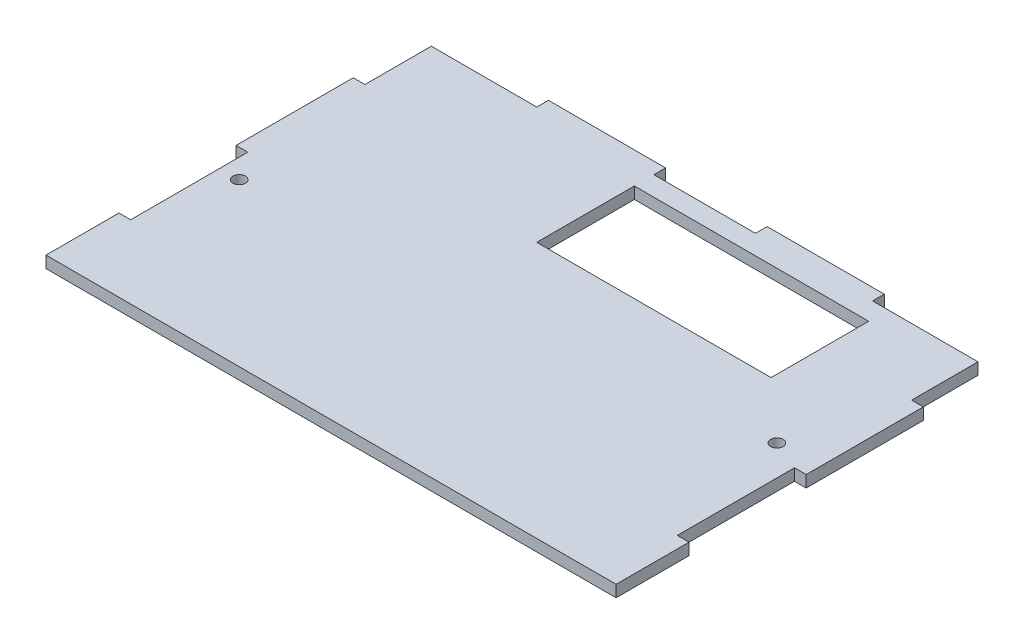
ISO-10303-21;
HEADER;
FILE_DESCRIPTION(('STEP AP214'),'2;1');
FILE_NAME('part.step','',(''),(''),'','','');
FILE_SCHEMA(('AUTOMOTIVE_DESIGN { 1 0 10303 214 1 1 1 1 }'));
ENDSEC;
DATA;
#1=APPLICATION_CONTEXT('core data for automotive mechanical design processes');
#2=APPLICATION_PROTOCOL_DEFINITION('international standard','automotive_design',2000,#1);
#3=PRODUCT_CONTEXT('',#1,'mechanical');
#4=PRODUCT('Part','Part','',(#3));
#5=PRODUCT_RELATED_PRODUCT_CATEGORY('part','',(#4));
#6=PRODUCT_DEFINITION_FORMATION('','',#4);
#7=PRODUCT_DEFINITION_CONTEXT('part definition',#1,'design');
#8=PRODUCT_DEFINITION('design','',#6,#7);
#9=PRODUCT_DEFINITION_SHAPE('','',#8);
#10=(LENGTH_UNIT() NAMED_UNIT(*) SI_UNIT(.MILLI.,.METRE.));
#11=(NAMED_UNIT(*) PLANE_ANGLE_UNIT() SI_UNIT($,.RADIAN.));
#12=(NAMED_UNIT(*) SI_UNIT($,.STERADIAN.) SOLID_ANGLE_UNIT());
#13=UNCERTAINTY_MEASURE_WITH_UNIT(LENGTH_MEASURE(1.E-05),#10,'distance_accuracy_value','');
#14=(GEOMETRIC_REPRESENTATION_CONTEXT(3) GLOBAL_UNCERTAINTY_ASSIGNED_CONTEXT((#13)) GLOBAL_UNIT_ASSIGNED_CONTEXT((#10,
#11,#12)) REPRESENTATION_CONTEXT('',''));
#15=CARTESIAN_POINT('',(0.,0.,0.));
#16=DIRECTION('',(0.,0.,1.));
#17=DIRECTION('',(1.,0.,0.));
#18=AXIS2_PLACEMENT_3D('',#15,#16,#17);
#19=CARTESIAN_POINT('',(-73.,3.,80.5));
#20=DIRECTION('',(1.,0.,0.));
#21=DIRECTION('',(0.,0.,-1.));
#22=AXIS2_PLACEMENT_3D('',#19,#20,#21);
#23=PLANE('',#22);
#24=DIRECTION('',(0.,0.,1.));
#25=VECTOR('',#24,1.);
#26=CARTESIAN_POINT('',(-73.,3.,80.5));
#27=LINE('',#26,#25);
#28=CARTESIAN_POINT('',(-73.,3.,-60.5));
#29=VERTEX_POINT('',#28);
#30=CARTESIAN_POINT('',(-73.,3.,-30.5));
#31=VERTEX_POINT('',#30);
#32=EDGE_CURVE('E281',#29,#31,#27,.T.);
#33=ORIENTED_EDGE('',*,*,#32,.F.);
#34=DIRECTION('',(0.,1.,0.));
#35=VECTOR('',#34,1.);
#36=CARTESIAN_POINT('',(-73.,0.,-60.5));
#37=LINE('',#36,#35);
#38=CARTESIAN_POINT('',(-73.,0.,-60.5));
#39=VERTEX_POINT('',#38);
#40=EDGE_CURVE('E478',#39,#29,#37,.T.);
#41=ORIENTED_EDGE('',*,*,#40,.F.);
#42=DIRECTION('',(0.,0.,1.));
#43=VECTOR('',#42,1.);
#44=CARTESIAN_POINT('',(-73.,0.,80.5));
#45=LINE('',#44,#43);
#46=CARTESIAN_POINT('',(-73.,0.,-30.5));
#47=VERTEX_POINT('',#46);
#48=EDGE_CURVE('E269',#39,#47,#45,.T.);
#49=ORIENTED_EDGE('',*,*,#48,.T.);
#50=DIRECTION('',(0.,1.,0.));
#51=VECTOR('',#50,1.);
#52=CARTESIAN_POINT('',(-73.,0.,-30.5));
#53=LINE('',#52,#51);
#54=EDGE_CURVE('E380',#47,#31,#53,.T.);
#55=ORIENTED_EDGE('',*,*,#54,.T.);
#56=EDGE_LOOP('',(#33,#41,#49,#55));
#57=FACE_BOUND('',#56,.T.);
#58=ADVANCED_FACE('F51',(#57),#23,.F.);
#59=CARTESIAN_POINT('',(-73.,0.,-0.500000000000014));
#60=VERTEX_POINT('',#59);
#61=CARTESIAN_POINT('',(-73.,0.,18.18));
#62=VERTEX_POINT('',#61);
#63=EDGE_CURVE('E271',#60,#62,#45,.T.);
#64=ORIENTED_EDGE('',*,*,#63,.T.);
#65=DIRECTION('',(0.,-1.,0.));
#66=VECTOR('',#65,1.);
#67=CARTESIAN_POINT('',(-73.,10.,18.18));
#68=LINE('',#67,#66);
#69=CARTESIAN_POINT('',(-73.,3.,18.18));
#70=VERTEX_POINT('',#69);
#71=EDGE_CURVE('E68',#70,#62,#68,.T.);
#72=ORIENTED_EDGE('',*,*,#71,.F.);
#73=CARTESIAN_POINT('',(-73.,3.,-0.500000000000014));
#74=VERTEX_POINT('',#73);
#75=EDGE_CURVE('E282',#74,#70,#27,.T.);
#76=ORIENTED_EDGE('',*,*,#75,.F.);
#77=DIRECTION('',(0.,1.,0.));
#78=VECTOR('',#77,1.);
#79=CARTESIAN_POINT('',(-73.,0.,-0.500000000000014));
#80=LINE('',#79,#78);
#81=EDGE_CURVE('E397',#60,#74,#80,.T.);
#82=ORIENTED_EDGE('',*,*,#81,.F.);
#83=EDGE_LOOP('',(#64,#72,#76,#82));
#84=FACE_BOUND('',#83,.T.);
#85=ADVANCED_FACE('F569',(#84),#23,.F.);
#86=CARTESIAN_POINT('',(73.,3.,80.5));
#87=DIRECTION('',(-1.,0.,0.));
#88=DIRECTION('',(0.,0.,1.));
#89=AXIS2_PLACEMENT_3D('',#86,#87,#88);
#90=PLANE('',#89);
#91=DIRECTION('',(0.,0.,-1.));
#92=VECTOR('',#91,1.);
#93=CARTESIAN_POINT('',(73.,3.,80.5));
#94=LINE('',#93,#92);
#95=CARTESIAN_POINT('',(73.,3.,18.18));
#96=VERTEX_POINT('',#95);
#97=CARTESIAN_POINT('',(73.,3.,-0.500000000000014));
#98=VERTEX_POINT('',#97);
#99=EDGE_CURVE('E253',#96,#98,#94,.T.);
#100=ORIENTED_EDGE('',*,*,#99,.F.);
#101=DIRECTION('',(0.,-1.,0.));
#102=VECTOR('',#101,1.);
#103=CARTESIAN_POINT('',(73.,10.,18.18));
#104=LINE('',#103,#102);
#105=CARTESIAN_POINT('',(73.,0.,18.18));
#106=VERTEX_POINT('',#105);
#107=EDGE_CURVE('E238',#96,#106,#104,.T.);
#108=ORIENTED_EDGE('',*,*,#107,.T.);
#109=DIRECTION('',(0.,0.,-1.));
#110=VECTOR('',#109,1.);
#111=CARTESIAN_POINT('',(73.,0.,80.5));
#112=LINE('',#111,#110);
#113=CARTESIAN_POINT('',(73.,0.,-0.500000000000014));
#114=VERTEX_POINT('',#113);
#115=EDGE_CURVE('E251',#106,#114,#112,.T.);
#116=ORIENTED_EDGE('',*,*,#115,.T.);
#117=DIRECTION('',(0.,1.,0.));
#118=VECTOR('',#117,1.);
#119=CARTESIAN_POINT('',(73.,0.,-0.500000000000014));
#120=LINE('',#119,#118);
#121=EDGE_CURVE('E343',#114,#98,#120,.T.);
#122=ORIENTED_EDGE('',*,*,#121,.T.);
#123=EDGE_LOOP('',(#100,#108,#116,#122));
#124=FACE_BOUND('',#123,.T.);
#125=ADVANCED_FACE('F249',(#124),#90,.F.);
#126=CARTESIAN_POINT('',(73.,3.,-80.5));
#127=DIRECTION('',(0.,0.,1.));
#128=DIRECTION('',(1.,0.,0.));
#129=AXIS2_PLACEMENT_3D('',#126,#127,#128);
#130=PLANE('',#129);
#131=DIRECTION('',(-1.,0.,0.));
#132=VECTOR('',#131,1.);
#133=CARTESIAN_POINT('',(73.,0.,-80.5));
#134=LINE('',#133,#132);
#135=CARTESIAN_POINT('',(-13.,0.,-80.5));
#136=VERTEX_POINT('',#135);
#137=CARTESIAN_POINT('',(-43.,0.,-80.5));
#138=VERTEX_POINT('',#137);
#139=EDGE_CURVE('E54',#136,#138,#134,.T.);
#140=ORIENTED_EDGE('',*,*,#139,.T.);
#141=DIRECTION('',(0.,1.,0.));
#142=VECTOR('',#141,1.);
#143=CARTESIAN_POINT('',(-43.,0.,-80.5));
#144=LINE('',#143,#142);
#145=CARTESIAN_POINT('',(-43.,3.,-80.5));
#146=VERTEX_POINT('',#145);
#147=EDGE_CURVE('E456',#138,#146,#144,.T.);
#148=ORIENTED_EDGE('',*,*,#147,.T.);
#149=DIRECTION('',(-1.,0.,0.));
#150=VECTOR('',#149,1.);
#151=CARTESIAN_POINT('',(73.,3.,-80.5));
#152=LINE('',#151,#150);
#153=CARTESIAN_POINT('',(-13.,3.,-80.5));
#154=VERTEX_POINT('',#153);
#155=EDGE_CURVE('E60',#154,#146,#152,.T.);
#156=ORIENTED_EDGE('',*,*,#155,.F.);
#157=DIRECTION('',(0.,1.,0.));
#158=VECTOR('',#157,1.);
#159=CARTESIAN_POINT('',(-13.,0.,-80.5));
#160=LINE('',#159,#158);
#161=EDGE_CURVE('E384',#136,#154,#160,.T.);
#162=ORIENTED_EDGE('',*,*,#161,.F.);
#163=EDGE_LOOP('',(#140,#148,#156,#162));
#164=FACE_BOUND('',#163,.T.);
#165=ADVANCED_FACE('F659',(#164),#130,.F.);
#166=CARTESIAN_POINT('',(73.,3.,-30.5));
#167=VERTEX_POINT('',#166);
#168=CARTESIAN_POINT('',(73.,3.,-60.5));
#169=VERTEX_POINT('',#168);
#170=EDGE_CURVE('E277',#167,#169,#94,.T.);
#171=ORIENTED_EDGE('',*,*,#170,.F.);
#172=DIRECTION('',(0.,1.,0.));
#173=VECTOR('',#172,1.);
#174=CARTESIAN_POINT('',(73.,0.,-30.5));
#175=LINE('',#174,#173);
#176=CARTESIAN_POINT('',(73.,0.,-30.5));
#177=VERTEX_POINT('',#176);
#178=EDGE_CURVE('E362',#177,#167,#175,.T.);
#179=ORIENTED_EDGE('',*,*,#178,.F.);
#180=CARTESIAN_POINT('',(73.,0.,-60.5));
#181=VERTEX_POINT('',#180);
#182=EDGE_CURVE('E263',#177,#181,#112,.T.);
#183=ORIENTED_EDGE('',*,*,#182,.T.);
#184=DIRECTION('',(0.,1.,0.));
#185=VECTOR('',#184,1.);
#186=CARTESIAN_POINT('',(73.,0.,-60.5));
#187=LINE('',#186,#185);
#188=EDGE_CURVE('E293',#181,#169,#187,.T.);
#189=ORIENTED_EDGE('',*,*,#188,.T.);
#190=EDGE_LOOP('',(#171,#179,#183,#189));
#191=FACE_BOUND('',#190,.T.);
#192=ADVANCED_FACE('F620',(#191),#90,.F.);
#193=CARTESIAN_POINT('',(43.,0.,-80.5));
#194=VERTEX_POINT('',#193);
#195=CARTESIAN_POINT('',(13.,0.,-80.5));
#196=VERTEX_POINT('',#195);
#197=EDGE_CURVE('E267',#194,#196,#134,.T.);
#198=ORIENTED_EDGE('',*,*,#197,.T.);
#199=DIRECTION('',(0.,1.,0.));
#200=VECTOR('',#199,1.);
#201=CARTESIAN_POINT('',(13.,0.,-80.5));
#202=LINE('',#201,#200);
#203=CARTESIAN_POINT('',(13.,3.,-80.5));
#204=VERTEX_POINT('',#203);
#205=EDGE_CURVE('E430',#196,#204,#202,.T.);
#206=ORIENTED_EDGE('',*,*,#205,.T.);
#207=CARTESIAN_POINT('',(43.,3.,-80.5));
#208=VERTEX_POINT('',#207);
#209=EDGE_CURVE('E11',#208,#204,#152,.T.);
#210=ORIENTED_EDGE('',*,*,#209,.F.);
#211=DIRECTION('',(0.,1.,0.));
#212=VECTOR('',#211,1.);
#213=CARTESIAN_POINT('',(43.,0.,-80.5));
#214=LINE('',#213,#212);
#215=EDGE_CURVE('E297',#194,#208,#214,.T.);
#216=ORIENTED_EDGE('',*,*,#215,.F.);
#217=EDGE_LOOP('',(#198,#206,#210,#216));
#218=FACE_BOUND('',#217,.T.);
#219=ADVANCED_FACE('F591',(#218),#130,.F.);
#220=CARTESIAN_POINT('',(0.,3.,0.));
#221=DIRECTION('',(0.,1.,0.));
#222=DIRECTION('',(0.,0.,1.));
#223=AXIS2_PLACEMENT_3D('',#220,#221,#222);
#224=PLANE('',#223);
#225=CARTESIAN_POINT('',(62.25,3.,-33.75));
#226=DIRECTION('',(0.,1.,0.));
#227=DIRECTION('',(0.,0.,1.));
#228=AXIS2_PLACEMENT_3D('',#225,#226,#227);
#229=CIRCLE('',#228,1.60000000000001);
#230=CARTESIAN_POINT('',(62.25,3.,-32.15));
#231=VERTEX_POINT('',#230);
#232=EDGE_CURVE('E245',#231,#231,#229,.T.);
#233=ORIENTED_EDGE('',*,*,#232,.F.);
#234=EDGE_LOOP('',(#233));
#235=FACE_BOUND('',#234,.T.);
#236=CARTESIAN_POINT('',(-65.,3.,-23.3));
#237=DIRECTION('',(0.,1.,0.));
#238=DIRECTION('',(0.,0.,1.));
#239=AXIS2_PLACEMENT_3D('',#236,#237,#238);
#240=CIRCLE('',#239,1.6);
#241=CARTESIAN_POINT('',(-65.,3.,-21.7));
#242=VERTEX_POINT('',#241);
#243=EDGE_CURVE('E534',#242,#242,#240,.T.);
#244=ORIENTED_EDGE('',*,*,#243,.F.);
#245=EDGE_LOOP('',(#244));
#246=FACE_BOUND('',#245,.T.);
#247=DIRECTION('',(-1.,0.,0.));
#248=VECTOR('',#247,1.);
#249=CARTESIAN_POINT('',(0.,3.,18.18));
#250=LINE('',#249,#248);
#251=EDGE_CURVE('E519',#96,#70,#250,.T.);
#252=ORIENTED_EDGE('',*,*,#251,.F.);
#253=ORIENTED_EDGE('',*,*,#99,.T.);
#254=DIRECTION('',(1.,0.,0.));
#255=VECTOR('',#254,1.);
#256=CARTESIAN_POINT('',(73.,3.,-0.500000000000014));
#257=LINE('',#256,#255);
#258=CARTESIAN_POINT('',(70.,3.,-0.500000000000014));
#259=VERTEX_POINT('',#258);
#260=EDGE_CURVE('E344',#259,#98,#257,.T.);
#261=ORIENTED_EDGE('',*,*,#260,.F.);
#262=DIRECTION('',(0.,0.,1.));
#263=VECTOR('',#262,1.);
#264=CARTESIAN_POINT('',(70.,3.,-0.500000000000014));
#265=LINE('',#264,#263);
#266=CARTESIAN_POINT('',(70.,3.,-30.5));
#267=VERTEX_POINT('',#266);
#268=EDGE_CURVE('E335',#267,#259,#265,.T.);
#269=ORIENTED_EDGE('',*,*,#268,.F.);
#270=DIRECTION('',(-1.,0.,0.));
#271=VECTOR('',#270,1.);
#272=CARTESIAN_POINT('',(70.,3.,-30.5));
#273=LINE('',#272,#271);
#274=EDGE_CURVE('E349',#167,#267,#273,.T.);
#275=ORIENTED_EDGE('',*,*,#274,.F.);
#276=ORIENTED_EDGE('',*,*,#170,.T.);
#277=DIRECTION('',(1.,0.,0.));
#278=VECTOR('',#277,1.);
#279=CARTESIAN_POINT('',(73.,3.,-60.5));
#280=LINE('',#279,#278);
#281=CARTESIAN_POINT('',(70.,3.,-60.5));
#282=VERTEX_POINT('',#281);
#283=EDGE_CURVE('E307',#282,#169,#280,.T.);
#284=ORIENTED_EDGE('',*,*,#283,.F.);
#285=DIRECTION('',(0.,0.,1.));
#286=VECTOR('',#285,1.);
#287=CARTESIAN_POINT('',(70.,3.,-77.5));
#288=LINE('',#287,#286);
#289=CARTESIAN_POINT('',(70.,3.,-77.5));
#290=VERTEX_POINT('',#289);
#291=EDGE_CURVE('E310',#290,#282,#288,.T.);
#292=ORIENTED_EDGE('',*,*,#291,.F.);
#293=DIRECTION('',(1.,0.,0.));
#294=VECTOR('',#293,1.);
#295=CARTESIAN_POINT('',(43.,3.,-77.5));
#296=LINE('',#295,#294);
#297=CARTESIAN_POINT('',(43.,3.,-77.5));
#298=VERTEX_POINT('',#297);
#299=EDGE_CURVE('E314',#298,#290,#296,.T.);
#300=ORIENTED_EDGE('',*,*,#299,.F.);
#301=DIRECTION('',(0.,0.,1.));
#302=VECTOR('',#301,1.);
#303=CARTESIAN_POINT('',(43.,3.,-80.5));
#304=LINE('',#303,#302);
#305=EDGE_CURVE('E302',#208,#298,#304,.T.);
#306=ORIENTED_EDGE('',*,*,#305,.F.);
#307=ORIENTED_EDGE('',*,*,#209,.T.);
#308=DIRECTION('',(0.,0.,-1.));
#309=VECTOR('',#308,1.);
#310=CARTESIAN_POINT('',(13.,3.,-80.5));
#311=LINE('',#310,#309);
#312=CARTESIAN_POINT('',(13.,3.,-77.5));
#313=VERTEX_POINT('',#312);
#314=EDGE_CURVE('E407',#313,#204,#311,.T.);
#315=ORIENTED_EDGE('',*,*,#314,.F.);
#316=DIRECTION('',(1.,0.,0.));
#317=VECTOR('',#316,1.);
#318=CARTESIAN_POINT('',(-13.,3.,-77.5));
#319=LINE('',#318,#317);
#320=CARTESIAN_POINT('',(-13.,3.,-77.5));
#321=VERTEX_POINT('',#320);
#322=EDGE_CURVE('E422',#321,#313,#319,.T.);
#323=ORIENTED_EDGE('',*,*,#322,.F.);
#324=DIRECTION('',(0.,0.,1.));
#325=VECTOR('',#324,1.);
#326=CARTESIAN_POINT('',(-13.,3.,-80.5));
#327=LINE('',#326,#325);
#328=EDGE_CURVE('E417',#154,#321,#327,.T.);
#329=ORIENTED_EDGE('',*,*,#328,.F.);
#330=ORIENTED_EDGE('',*,*,#155,.T.);
#331=DIRECTION('',(0.,0.,-1.));
#332=VECTOR('',#331,1.);
#333=CARTESIAN_POINT('',(-43.,3.,-80.5));
#334=LINE('',#333,#332);
#335=CARTESIAN_POINT('',(-43.,3.,-77.5));
#336=VERTEX_POINT('',#335);
#337=EDGE_CURVE('E318',#336,#146,#334,.T.);
#338=ORIENTED_EDGE('',*,*,#337,.F.);
#339=DIRECTION('',(1.,0.,0.));
#340=VECTOR('',#339,1.);
#341=CARTESIAN_POINT('',(-43.,3.,-77.5));
#342=LINE('',#341,#340);
#343=CARTESIAN_POINT('',(-70.,3.,-77.5));
#344=VERTEX_POINT('',#343);
#345=EDGE_CURVE('E443',#344,#336,#342,.T.);
#346=ORIENTED_EDGE('',*,*,#345,.F.);
#347=DIRECTION('',(0.,0.,-1.));
#348=VECTOR('',#347,1.);
#349=CARTESIAN_POINT('',(-70.,3.,-77.5));
#350=LINE('',#349,#348);
#351=CARTESIAN_POINT('',(-70.,3.,-60.5));
#352=VERTEX_POINT('',#351);
#353=EDGE_CURVE('E463',#352,#344,#350,.T.);
#354=ORIENTED_EDGE('',*,*,#353,.F.);
#355=DIRECTION('',(1.,0.,0.));
#356=VECTOR('',#355,1.);
#357=CARTESIAN_POINT('',(-73.,3.,-60.5));
#358=LINE('',#357,#356);
#359=EDGE_CURVE('E459',#29,#352,#358,.T.);
#360=ORIENTED_EDGE('',*,*,#359,.F.);
#361=ORIENTED_EDGE('',*,*,#32,.T.);
#362=DIRECTION('',(-1.,0.,0.));
#363=VECTOR('',#362,1.);
#364=CARTESIAN_POINT('',(-70.,3.,-30.5));
#365=LINE('',#364,#363);
#366=CARTESIAN_POINT('',(-70.,3.,-30.5));
#367=VERTEX_POINT('',#366);
#368=EDGE_CURVE('E381',#367,#31,#365,.T.);
#369=ORIENTED_EDGE('',*,*,#368,.F.);
#370=DIRECTION('',(0.,0.,-1.));
#371=VECTOR('',#370,1.);
#372=CARTESIAN_POINT('',(-70.,3.,-30.5));
#373=LINE('',#372,#371);
#374=CARTESIAN_POINT('',(-70.,3.,-0.500000000000014));
#375=VERTEX_POINT('',#374);
#376=EDGE_CURVE('E371',#375,#367,#373,.T.);
#377=ORIENTED_EDGE('',*,*,#376,.F.);
#378=DIRECTION('',(1.,0.,0.));
#379=VECTOR('',#378,1.);
#380=CARTESIAN_POINT('',(-73.,3.,-0.500000000000014));
#381=LINE('',#380,#379);
#382=EDGE_CURVE('E385',#74,#375,#381,.T.);
#383=ORIENTED_EDGE('',*,*,#382,.F.);
#384=ORIENTED_EDGE('',*,*,#75,.T.);
#385=EDGE_LOOP('',(#252,#253,#261,#269,#275,#276,#284,#292,#300,#306,#307,#315,#323,#329,#330,
#338,#346,#354,#360,#361,#369,#377,#383,#384));
#386=FACE_BOUND('',#385,.T.);
#387=DIRECTION('',(0.,0.,1.));
#388=VECTOR('',#387,1.);
#389=CARTESIAN_POINT('',(-13.,3.,-72.5));
#390=LINE('',#389,#388);
#391=CARTESIAN_POINT('',(-13.,3.,-72.5));
#392=VERTEX_POINT('',#391);
#393=CARTESIAN_POINT('',(-13.,3.,-47.5));
#394=VERTEX_POINT('',#393);
#395=EDGE_CURVE('E76',#392,#394,#390,.T.);
#396=ORIENTED_EDGE('',*,*,#395,.F.);
#397=DIRECTION('',(-1.,0.,0.));
#398=VECTOR('',#397,1.);
#399=CARTESIAN_POINT('',(-13.,3.,-72.5));
#400=LINE('',#399,#398);
#401=CARTESIAN_POINT('',(47.,3.,-72.5));
#402=VERTEX_POINT('',#401);
#403=EDGE_CURVE('E488',#402,#392,#400,.T.);
#404=ORIENTED_EDGE('',*,*,#403,.F.);
#405=DIRECTION('',(0.,0.,-1.));
#406=VECTOR('',#405,1.);
#407=CARTESIAN_POINT('',(47.,3.,-72.5));
#408=LINE('',#407,#406);
#409=CARTESIAN_POINT('',(47.,3.,-47.5));
#410=VERTEX_POINT('',#409);
#411=EDGE_CURVE('E508',#410,#402,#408,.T.);
#412=ORIENTED_EDGE('',*,*,#411,.F.);
#413=DIRECTION('',(1.,0.,0.));
#414=VECTOR('',#413,1.);
#415=CARTESIAN_POINT('',(-13.,3.,-47.5));
#416=LINE('',#415,#414);
#417=EDGE_CURVE('E504',#394,#410,#416,.T.);
#418=ORIENTED_EDGE('',*,*,#417,.F.);
#419=EDGE_LOOP('',(#396,#404,#412,#418));
#420=FACE_BOUND('',#419,.T.);
#421=ADVANCED_FACE('F552',(#235,#246,#386,#420),#224,.T.);
#422=CARTESIAN_POINT('',(0.,0.,0.));
#423=DIRECTION('',(0.,1.,0.));
#424=DIRECTION('',(0.,0.,1.));
#425=AXIS2_PLACEMENT_3D('',#422,#423,#424);
#426=PLANE('',#425);
#427=CARTESIAN_POINT('',(62.25,0.,-33.75));
#428=DIRECTION('',(0.,-1.,0.));
#429=DIRECTION('',(0.,0.,-1.));
#430=AXIS2_PLACEMENT_3D('',#427,#428,#429);
#431=CIRCLE('',#430,1.60000000000001);
#432=CARTESIAN_POINT('',(62.25,0.,-35.35));
#433=VERTEX_POINT('',#432);
#434=EDGE_CURVE('E538',#433,#433,#431,.T.);
#435=ORIENTED_EDGE('',*,*,#434,.F.);
#436=EDGE_LOOP('',(#435));
#437=FACE_BOUND('',#436,.T.);
#438=CARTESIAN_POINT('',(-65.,0.,-23.3));
#439=DIRECTION('',(0.,-1.,0.));
#440=DIRECTION('',(0.,0.,-1.));
#441=AXIS2_PLACEMENT_3D('',#438,#439,#440);
#442=CIRCLE('',#441,1.6);
#443=CARTESIAN_POINT('',(-65.,0.,-24.9));
#444=VERTEX_POINT('',#443);
#445=EDGE_CURVE('E539',#444,#444,#442,.T.);
#446=ORIENTED_EDGE('',*,*,#445,.F.);
#447=EDGE_LOOP('',(#446));
#448=FACE_BOUND('',#447,.T.);
#449=ORIENTED_EDGE('',*,*,#115,.F.);
#450=DIRECTION('',(1.,0.,0.));
#451=VECTOR('',#450,1.);
#452=CARTESIAN_POINT('',(-73.,0.,18.18));
#453=LINE('',#452,#451);
#454=EDGE_CURVE('E235',#62,#106,#453,.T.);
#455=ORIENTED_EDGE('',*,*,#454,.F.);
#456=ORIENTED_EDGE('',*,*,#63,.F.);
#457=DIRECTION('',(1.,0.,0.));
#458=VECTOR('',#457,1.);
#459=CARTESIAN_POINT('',(-73.,0.,-0.500000000000014));
#460=LINE('',#459,#458);
#461=CARTESIAN_POINT('',(-70.,0.,-0.500000000000014));
#462=VERTEX_POINT('',#461);
#463=EDGE_CURVE('E372',#60,#462,#460,.T.);
#464=ORIENTED_EDGE('',*,*,#463,.T.);
#465=DIRECTION('',(0.,0.,-1.));
#466=VECTOR('',#465,1.);
#467=CARTESIAN_POINT('',(-70.,0.,-30.5));
#468=LINE('',#467,#466);
#469=CARTESIAN_POINT('',(-70.,0.,-30.5));
#470=VERTEX_POINT('',#469);
#471=EDGE_CURVE('E376',#462,#470,#468,.T.);
#472=ORIENTED_EDGE('',*,*,#471,.T.);
#473=DIRECTION('',(-1.,0.,0.));
#474=VECTOR('',#473,1.);
#475=CARTESIAN_POINT('',(-70.,0.,-30.5));
#476=LINE('',#475,#474);
#477=EDGE_CURVE('E367',#470,#47,#476,.T.);
#478=ORIENTED_EDGE('',*,*,#477,.T.);
#479=ORIENTED_EDGE('',*,*,#48,.F.);
#480=DIRECTION('',(1.,0.,0.));
#481=VECTOR('',#480,1.);
#482=CARTESIAN_POINT('',(-73.,0.,-60.5));
#483=LINE('',#482,#481);
#484=CARTESIAN_POINT('',(-70.,0.,-60.5));
#485=VERTEX_POINT('',#484);
#486=EDGE_CURVE('E444',#39,#485,#483,.T.);
#487=ORIENTED_EDGE('',*,*,#486,.T.);
#488=DIRECTION('',(0.,0.,-1.));
#489=VECTOR('',#488,1.);
#490=CARTESIAN_POINT('',(-70.,0.,-77.5));
#491=LINE('',#490,#489);
#492=CARTESIAN_POINT('',(-70.,0.,-77.5));
#493=VERTEX_POINT('',#492);
#494=EDGE_CURVE('E448',#485,#493,#491,.T.);
#495=ORIENTED_EDGE('',*,*,#494,.T.);
#496=DIRECTION('',(1.,0.,0.));
#497=VECTOR('',#496,1.);
#498=CARTESIAN_POINT('',(-43.,0.,-77.5));
#499=LINE('',#498,#497);
#500=CARTESIAN_POINT('',(-43.,0.,-77.5));
#501=VERTEX_POINT('',#500);
#502=EDGE_CURVE('E452',#493,#501,#499,.T.);
#503=ORIENTED_EDGE('',*,*,#502,.T.);
#504=DIRECTION('',(0.,0.,-1.));
#505=VECTOR('',#504,1.);
#506=CARTESIAN_POINT('',(-43.,0.,-80.5));
#507=LINE('',#506,#505);
#508=EDGE_CURVE('E439',#501,#138,#507,.T.);
#509=ORIENTED_EDGE('',*,*,#508,.T.);
#510=ORIENTED_EDGE('',*,*,#139,.F.);
#511=DIRECTION('',(0.,0.,1.));
#512=VECTOR('',#511,1.);
#513=CARTESIAN_POINT('',(-13.,0.,-80.5));
#514=LINE('',#513,#512);
#515=CARTESIAN_POINT('',(-13.,0.,-77.5));
#516=VERTEX_POINT('',#515);
#517=EDGE_CURVE('E403',#136,#516,#514,.T.);
#518=ORIENTED_EDGE('',*,*,#517,.T.);
#519=DIRECTION('',(1.,0.,0.));
#520=VECTOR('',#519,1.);
#521=CARTESIAN_POINT('',(-13.,0.,-77.5));
#522=LINE('',#521,#520);
#523=CARTESIAN_POINT('',(13.,0.,-77.5));
#524=VERTEX_POINT('',#523);
#525=EDGE_CURVE('E408',#516,#524,#522,.T.);
#526=ORIENTED_EDGE('',*,*,#525,.T.);
#527=DIRECTION('',(0.,0.,-1.));
#528=VECTOR('',#527,1.);
#529=CARTESIAN_POINT('',(13.,0.,-80.5));
#530=LINE('',#529,#528);
#531=EDGE_CURVE('E412',#524,#196,#530,.T.);
#532=ORIENTED_EDGE('',*,*,#531,.T.);
#533=ORIENTED_EDGE('',*,*,#197,.F.);
#534=DIRECTION('',(0.,0.,1.));
#535=VECTOR('',#534,1.);
#536=CARTESIAN_POINT('',(43.,0.,-80.5));
#537=LINE('',#536,#535);
#538=CARTESIAN_POINT('',(43.,0.,-77.5));
#539=VERTEX_POINT('',#538);
#540=EDGE_CURVE('E290',#194,#539,#537,.T.);
#541=ORIENTED_EDGE('',*,*,#540,.T.);
#542=DIRECTION('',(1.,0.,0.));
#543=VECTOR('',#542,1.);
#544=CARTESIAN_POINT('',(43.,0.,-77.5));
#545=LINE('',#544,#543);
#546=CARTESIAN_POINT('',(70.,0.,-77.5));
#547=VERTEX_POINT('',#546);
#548=EDGE_CURVE('E306',#539,#547,#545,.T.);
#549=ORIENTED_EDGE('',*,*,#548,.T.);
#550=DIRECTION('',(0.,0.,1.));
#551=VECTOR('',#550,1.);
#552=CARTESIAN_POINT('',(70.,0.,-77.5));
#553=LINE('',#552,#551);
#554=CARTESIAN_POINT('',(70.,0.,-60.5));
#555=VERTEX_POINT('',#554);
#556=EDGE_CURVE('E326',#547,#555,#553,.T.);
#557=ORIENTED_EDGE('',*,*,#556,.T.);
#558=DIRECTION('',(1.,0.,0.));
#559=VECTOR('',#558,1.);
#560=CARTESIAN_POINT('',(73.,0.,-60.5));
#561=LINE('',#560,#559);
#562=EDGE_CURVE('E322',#555,#181,#561,.T.);
#563=ORIENTED_EDGE('',*,*,#562,.T.);
#564=ORIENTED_EDGE('',*,*,#182,.F.);
#565=DIRECTION('',(-1.,0.,0.));
#566=VECTOR('',#565,1.);
#567=CARTESIAN_POINT('',(70.,0.,-30.5));
#568=LINE('',#567,#566);
#569=CARTESIAN_POINT('',(70.,0.,-30.5));
#570=VERTEX_POINT('',#569);
#571=EDGE_CURVE('E336',#177,#570,#568,.T.);
#572=ORIENTED_EDGE('',*,*,#571,.T.);
#573=DIRECTION('',(0.,0.,1.));
#574=VECTOR('',#573,1.);
#575=CARTESIAN_POINT('',(70.,0.,-0.500000000000014));
#576=LINE('',#575,#574);
#577=CARTESIAN_POINT('',(70.,0.,-0.500000000000014));
#578=VERTEX_POINT('',#577);
#579=EDGE_CURVE('E340',#570,#578,#576,.T.);
#580=ORIENTED_EDGE('',*,*,#579,.T.);
#581=DIRECTION('',(1.,0.,0.));
#582=VECTOR('',#581,1.);
#583=CARTESIAN_POINT('',(73.,0.,-0.500000000000014));
#584=LINE('',#583,#582);
#585=EDGE_CURVE('E261',#578,#114,#584,.T.);
#586=ORIENTED_EDGE('',*,*,#585,.T.);
#587=EDGE_LOOP('',(#449,#455,#456,#464,#472,#478,#479,#487,#495,#503,#509,#510,#518,#526,#532,
#533,#541,#549,#557,#563,#564,#572,#580,#586));
#588=FACE_BOUND('',#587,.T.);
#589=DIRECTION('',(-1.,0.,0.));
#590=VECTOR('',#589,1.);
#591=CARTESIAN_POINT('',(-13.,0.,-72.5));
#592=LINE('',#591,#590);
#593=CARTESIAN_POINT('',(47.,0.,-72.5));
#594=VERTEX_POINT('',#593);
#595=CARTESIAN_POINT('',(-13.,0.,-72.5));
#596=VERTEX_POINT('',#595);
#597=EDGE_CURVE('E497',#594,#596,#592,.T.);
#598=ORIENTED_EDGE('',*,*,#597,.T.);
#599=DIRECTION('',(0.,0.,1.));
#600=VECTOR('',#599,1.);
#601=CARTESIAN_POINT('',(-13.,0.,-72.5));
#602=LINE('',#601,#600);
#603=CARTESIAN_POINT('',(-13.,0.,-47.5));
#604=VERTEX_POINT('',#603);
#605=EDGE_CURVE('E484',#596,#604,#602,.T.);
#606=ORIENTED_EDGE('',*,*,#605,.T.);
#607=DIRECTION('',(1.,0.,0.));
#608=VECTOR('',#607,1.);
#609=CARTESIAN_POINT('',(-13.,0.,-47.5));
#610=LINE('',#609,#608);
#611=CARTESIAN_POINT('',(47.,0.,-47.5));
#612=VERTEX_POINT('',#611);
#613=EDGE_CURVE('E489',#604,#612,#610,.T.);
#614=ORIENTED_EDGE('',*,*,#613,.T.);
#615=DIRECTION('',(0.,0.,-1.));
#616=VECTOR('',#615,1.);
#617=CARTESIAN_POINT('',(47.,0.,-72.5));
#618=LINE('',#617,#616);
#619=EDGE_CURVE('E493',#612,#594,#618,.T.);
#620=ORIENTED_EDGE('',*,*,#619,.T.);
#621=EDGE_LOOP('',(#598,#606,#614,#620));
#622=FACE_BOUND('',#621,.T.);
#623=ADVANCED_FACE('F257',(#437,#448,#588,#622),#426,.F.);
#624=CARTESIAN_POINT('',(43.,0.,-77.5));
#625=DIRECTION('',(0.,0.,1.));
#626=DIRECTION('',(1.,0.,0.));
#627=AXIS2_PLACEMENT_3D('',#624,#625,#626);
#628=PLANE('',#627);
#629=ORIENTED_EDGE('',*,*,#299,.T.);
#630=DIRECTION('',(0.,1.,0.));
#631=VECTOR('',#630,1.);
#632=CARTESIAN_POINT('',(70.,0.,-77.5));
#633=LINE('',#632,#631);
#634=EDGE_CURVE('E286',#547,#290,#633,.T.);
#635=ORIENTED_EDGE('',*,*,#634,.F.);
#636=ORIENTED_EDGE('',*,*,#548,.F.);
#637=DIRECTION('',(0.,1.,0.));
#638=VECTOR('',#637,1.);
#639=CARTESIAN_POINT('',(43.,0.,-77.5));
#640=LINE('',#639,#638);
#641=EDGE_CURVE('E273',#539,#298,#640,.T.);
#642=ORIENTED_EDGE('',*,*,#641,.T.);
#643=EDGE_LOOP('',(#629,#635,#636,#642));
#644=FACE_BOUND('',#643,.T.);
#645=ADVANCED_FACE('F551',(#644),#628,.F.);
#646=CARTESIAN_POINT('',(43.,0.,-80.5));
#647=DIRECTION('',(-1.,0.,0.));
#648=DIRECTION('',(0.,0.,1.));
#649=AXIS2_PLACEMENT_3D('',#646,#647,#648);
#650=PLANE('',#649);
#651=ORIENTED_EDGE('',*,*,#305,.T.);
#652=ORIENTED_EDGE('',*,*,#641,.F.);
#653=ORIENTED_EDGE('',*,*,#540,.F.);
#654=ORIENTED_EDGE('',*,*,#215,.T.);
#655=EDGE_LOOP('',(#651,#652,#653,#654));
#656=FACE_BOUND('',#655,.T.);
#657=ADVANCED_FACE('F607',(#656),#650,.F.);
#658=CARTESIAN_POINT('',(73.,0.,-60.5));
#659=DIRECTION('',(0.,0.,1.));
#660=DIRECTION('',(1.,0.,0.));
#661=AXIS2_PLACEMENT_3D('',#658,#659,#660);
#662=PLANE('',#661);
#663=ORIENTED_EDGE('',*,*,#283,.T.);
#664=ORIENTED_EDGE('',*,*,#188,.F.);
#665=ORIENTED_EDGE('',*,*,#562,.F.);
#666=DIRECTION('',(0.,1.,0.));
#667=VECTOR('',#666,1.);
#668=CARTESIAN_POINT('',(70.,0.,-60.5));
#669=LINE('',#668,#667);
#670=EDGE_CURVE('E289',#555,#282,#669,.T.);
#671=ORIENTED_EDGE('',*,*,#670,.T.);
#672=EDGE_LOOP('',(#663,#664,#665,#671));
#673=FACE_BOUND('',#672,.T.);
#674=ADVANCED_FACE('F617',(#673),#662,.F.);
#675=CARTESIAN_POINT('',(70.,0.,-77.5));
#676=DIRECTION('',(-1.,0.,0.));
#677=DIRECTION('',(0.,0.,1.));
#678=AXIS2_PLACEMENT_3D('',#675,#676,#677);
#679=PLANE('',#678);
#680=ORIENTED_EDGE('',*,*,#291,.T.);
#681=ORIENTED_EDGE('',*,*,#670,.F.);
#682=ORIENTED_EDGE('',*,*,#556,.F.);
#683=ORIENTED_EDGE('',*,*,#634,.T.);
#684=EDGE_LOOP('',(#680,#681,#682,#683));
#685=FACE_BOUND('',#684,.T.);
#686=ADVANCED_FACE('F614',(#685),#679,.F.);
#687=CARTESIAN_POINT('',(-13.,0.,-72.5));
#688=DIRECTION('',(-1.,0.,0.));
#689=DIRECTION('',(0.,0.,1.));
#690=AXIS2_PLACEMENT_3D('',#687,#688,#689);
#691=PLANE('',#690);
#692=ORIENTED_EDGE('',*,*,#395,.T.);
#693=DIRECTION('',(0.,1.,0.));
#694=VECTOR('',#693,1.);
#695=CARTESIAN_POINT('',(-13.,0.,-47.5));
#696=LINE('',#695,#694);
#697=EDGE_CURVE('E501',#604,#394,#696,.T.);
#698=ORIENTED_EDGE('',*,*,#697,.F.);
#699=ORIENTED_EDGE('',*,*,#605,.F.);
#700=DIRECTION('',(0.,1.,0.));
#701=VECTOR('',#700,1.);
#702=CARTESIAN_POINT('',(-13.,0.,-72.5));
#703=LINE('',#702,#701);
#704=EDGE_CURVE('E515',#596,#392,#703,.T.);
#705=ORIENTED_EDGE('',*,*,#704,.T.);
#706=EDGE_LOOP('',(#692,#698,#699,#705));
#707=FACE_BOUND('',#706,.T.);
#708=ADVANCED_FACE('F704',(#707),#691,.F.);
#709=CARTESIAN_POINT('',(-13.,0.,-72.5));
#710=DIRECTION('',(0.,0.,-1.));
#711=DIRECTION('',(-1.,0.,0.));
#712=AXIS2_PLACEMENT_3D('',#709,#710,#711);
#713=PLANE('',#712);
#714=ORIENTED_EDGE('',*,*,#403,.T.);
#715=ORIENTED_EDGE('',*,*,#704,.F.);
#716=ORIENTED_EDGE('',*,*,#597,.F.);
#717=DIRECTION('',(0.,1.,0.));
#718=VECTOR('',#717,1.);
#719=CARTESIAN_POINT('',(47.,0.,-72.5));
#720=LINE('',#719,#718);
#721=EDGE_CURVE('E518',#594,#402,#720,.T.);
#722=ORIENTED_EDGE('',*,*,#721,.T.);
#723=EDGE_LOOP('',(#714,#715,#716,#722));
#724=FACE_BOUND('',#723,.T.);
#725=ADVANCED_FACE('F675',(#724),#713,.F.);
#726=CARTESIAN_POINT('',(47.,0.,-72.5));
#727=DIRECTION('',(1.,0.,0.));
#728=DIRECTION('',(0.,0.,-1.));
#729=AXIS2_PLACEMENT_3D('',#726,#727,#728);
#730=PLANE('',#729);
#731=ORIENTED_EDGE('',*,*,#411,.T.);
#732=ORIENTED_EDGE('',*,*,#721,.F.);
#733=ORIENTED_EDGE('',*,*,#619,.F.);
#734=DIRECTION('',(0.,1.,0.));
#735=VECTOR('',#734,1.);
#736=CARTESIAN_POINT('',(47.,0.,-47.5));
#737=LINE('',#736,#735);
#738=EDGE_CURVE('E522',#612,#410,#737,.T.);
#739=ORIENTED_EDGE('',*,*,#738,.T.);
#740=EDGE_LOOP('',(#731,#732,#733,#739));
#741=FACE_BOUND('',#740,.T.);
#742=ADVANCED_FACE('F797',(#741),#730,.F.);
#743=CARTESIAN_POINT('',(-13.,0.,-47.5));
#744=DIRECTION('',(0.,0.,1.));
#745=DIRECTION('',(1.,0.,0.));
#746=AXIS2_PLACEMENT_3D('',#743,#744,#745);
#747=PLANE('',#746);
#748=ORIENTED_EDGE('',*,*,#417,.T.);
#749=ORIENTED_EDGE('',*,*,#738,.F.);
#750=ORIENTED_EDGE('',*,*,#613,.F.);
#751=ORIENTED_EDGE('',*,*,#697,.T.);
#752=EDGE_LOOP('',(#748,#749,#750,#751));
#753=FACE_BOUND('',#752,.T.);
#754=ADVANCED_FACE('F693',(#753),#747,.F.);
#755=CARTESIAN_POINT('',(73.,0.,-0.500000000000014));
#756=DIRECTION('',(0.,0.,1.));
#757=DIRECTION('',(1.,0.,0.));
#758=AXIS2_PLACEMENT_3D('',#755,#756,#757);
#759=PLANE('',#758);
#760=ORIENTED_EDGE('',*,*,#260,.T.);
#761=ORIENTED_EDGE('',*,*,#121,.F.);
#762=ORIENTED_EDGE('',*,*,#585,.F.);
#763=DIRECTION('',(0.,1.,0.));
#764=VECTOR('',#763,1.);
#765=CARTESIAN_POINT('',(70.,0.,-0.500000000000014));
#766=LINE('',#765,#764);
#767=EDGE_CURVE('E356',#578,#259,#766,.T.);
#768=ORIENTED_EDGE('',*,*,#767,.T.);
#769=EDGE_LOOP('',(#760,#761,#762,#768));
#770=FACE_BOUND('',#769,.T.);
#771=ADVANCED_FACE('F631',(#770),#759,.F.);
#772=CARTESIAN_POINT('',(70.,0.,-0.500000000000014));
#773=DIRECTION('',(-1.,0.,0.));
#774=DIRECTION('',(0.,0.,1.));
#775=AXIS2_PLACEMENT_3D('',#772,#773,#774);
#776=PLANE('',#775);
#777=ORIENTED_EDGE('',*,*,#268,.T.);
#778=ORIENTED_EDGE('',*,*,#767,.F.);
#779=ORIENTED_EDGE('',*,*,#579,.F.);
#780=DIRECTION('',(0.,1.,0.));
#781=VECTOR('',#780,1.);
#782=CARTESIAN_POINT('',(70.,0.,-30.5));
#783=LINE('',#782,#781);
#784=EDGE_CURVE('E359',#570,#267,#783,.T.);
#785=ORIENTED_EDGE('',*,*,#784,.T.);
#786=EDGE_LOOP('',(#777,#778,#779,#785));
#787=FACE_BOUND('',#786,.T.);
#788=ADVANCED_FACE('F629',(#787),#776,.F.);
#789=CARTESIAN_POINT('',(70.,0.,-30.5));
#790=DIRECTION('',(0.,0.,-1.));
#791=DIRECTION('',(-1.,0.,0.));
#792=AXIS2_PLACEMENT_3D('',#789,#790,#791);
#793=PLANE('',#792);
#794=ORIENTED_EDGE('',*,*,#274,.T.);
#795=ORIENTED_EDGE('',*,*,#784,.F.);
#796=ORIENTED_EDGE('',*,*,#571,.F.);
#797=ORIENTED_EDGE('',*,*,#178,.T.);
#798=EDGE_LOOP('',(#794,#795,#796,#797));
#799=FACE_BOUND('',#798,.T.);
#800=ADVANCED_FACE('F627',(#799),#793,.F.);
#801=CARTESIAN_POINT('',(-70.,0.,-30.5));
#802=DIRECTION('',(0.,0.,-1.));
#803=DIRECTION('',(-1.,0.,0.));
#804=AXIS2_PLACEMENT_3D('',#801,#802,#803);
#805=PLANE('',#804);
#806=ORIENTED_EDGE('',*,*,#368,.T.);
#807=ORIENTED_EDGE('',*,*,#54,.F.);
#808=ORIENTED_EDGE('',*,*,#477,.F.);
#809=DIRECTION('',(0.,1.,0.));
#810=VECTOR('',#809,1.);
#811=CARTESIAN_POINT('',(-70.,0.,-30.5));
#812=LINE('',#811,#810);
#813=EDGE_CURVE('E348',#470,#367,#812,.T.);
#814=ORIENTED_EDGE('',*,*,#813,.T.);
#815=EDGE_LOOP('',(#806,#807,#808,#814));
#816=FACE_BOUND('',#815,.T.);
#817=ADVANCED_FACE('F643',(#816),#805,.F.);
#818=CARTESIAN_POINT('',(-70.,0.,-30.5));
#819=DIRECTION('',(1.,0.,0.));
#820=DIRECTION('',(0.,0.,-1.));
#821=AXIS2_PLACEMENT_3D('',#818,#819,#820);
#822=PLANE('',#821);
#823=ORIENTED_EDGE('',*,*,#376,.T.);
#824=ORIENTED_EDGE('',*,*,#813,.F.);
#825=ORIENTED_EDGE('',*,*,#471,.F.);
#826=DIRECTION('',(0.,1.,0.));
#827=VECTOR('',#826,1.);
#828=CARTESIAN_POINT('',(-70.,0.,-0.500000000000014));
#829=LINE('',#828,#827);
#830=EDGE_CURVE('E394',#462,#375,#829,.T.);
#831=ORIENTED_EDGE('',*,*,#830,.T.);
#832=EDGE_LOOP('',(#823,#824,#825,#831));
#833=FACE_BOUND('',#832,.T.);
#834=ADVANCED_FACE('F640',(#833),#822,.F.);
#835=CARTESIAN_POINT('',(-73.,0.,-0.500000000000014));
#836=DIRECTION('',(0.,0.,1.));
#837=DIRECTION('',(1.,0.,0.));
#838=AXIS2_PLACEMENT_3D('',#835,#836,#837);
#839=PLANE('',#838);
#840=ORIENTED_EDGE('',*,*,#382,.T.);
#841=ORIENTED_EDGE('',*,*,#830,.F.);
#842=ORIENTED_EDGE('',*,*,#463,.F.);
#843=ORIENTED_EDGE('',*,*,#81,.T.);
#844=EDGE_LOOP('',(#840,#841,#842,#843));
#845=FACE_BOUND('',#844,.T.);
#846=ADVANCED_FACE('F637',(#845),#839,.F.);
#847=CARTESIAN_POINT('',(-13.,0.,-80.5));
#848=DIRECTION('',(-1.,0.,0.));
#849=DIRECTION('',(0.,0.,1.));
#850=AXIS2_PLACEMENT_3D('',#847,#848,#849);
#851=PLANE('',#850);
#852=ORIENTED_EDGE('',*,*,#328,.T.);
#853=DIRECTION('',(0.,1.,0.));
#854=VECTOR('',#853,1.);
#855=CARTESIAN_POINT('',(-13.,0.,-77.5));
#856=LINE('',#855,#854);
#857=EDGE_CURVE('E416',#516,#321,#856,.T.);
#858=ORIENTED_EDGE('',*,*,#857,.F.);
#859=ORIENTED_EDGE('',*,*,#517,.F.);
#860=ORIENTED_EDGE('',*,*,#161,.T.);
#861=EDGE_LOOP('',(#852,#858,#859,#860));
#862=FACE_BOUND('',#861,.T.);
#863=ADVANCED_FACE('F662',(#862),#851,.F.);
#864=CARTESIAN_POINT('',(13.,0.,-80.5));
#865=DIRECTION('',(1.,0.,0.));
#866=DIRECTION('',(0.,0.,-1.));
#867=AXIS2_PLACEMENT_3D('',#864,#865,#866);
#868=PLANE('',#867);
#869=ORIENTED_EDGE('',*,*,#314,.T.);
#870=ORIENTED_EDGE('',*,*,#205,.F.);
#871=ORIENTED_EDGE('',*,*,#531,.F.);
#872=DIRECTION('',(0.,1.,0.));
#873=VECTOR('',#872,1.);
#874=CARTESIAN_POINT('',(13.,0.,-77.5));
#875=LINE('',#874,#873);
#876=EDGE_CURVE('E434',#524,#313,#875,.T.);
#877=ORIENTED_EDGE('',*,*,#876,.T.);
#878=EDGE_LOOP('',(#869,#870,#871,#877));
#879=FACE_BOUND('',#878,.T.);
#880=ADVANCED_FACE('F596',(#879),#868,.F.);
#881=CARTESIAN_POINT('',(-13.,0.,-77.5));
#882=DIRECTION('',(0.,0.,1.));
#883=DIRECTION('',(1.,0.,0.));
#884=AXIS2_PLACEMENT_3D('',#881,#882,#883);
#885=PLANE('',#884);
#886=ORIENTED_EDGE('',*,*,#322,.T.);
#887=ORIENTED_EDGE('',*,*,#876,.F.);
#888=ORIENTED_EDGE('',*,*,#525,.F.);
#889=ORIENTED_EDGE('',*,*,#857,.T.);
#890=EDGE_LOOP('',(#886,#887,#888,#889));
#891=FACE_BOUND('',#890,.T.);
#892=ADVANCED_FACE('F598',(#891),#885,.F.);
#893=CARTESIAN_POINT('',(-43.,0.,-80.5));
#894=DIRECTION('',(1.,0.,0.));
#895=DIRECTION('',(0.,0.,-1.));
#896=AXIS2_PLACEMENT_3D('',#893,#894,#895);
#897=PLANE('',#896);
#898=ORIENTED_EDGE('',*,*,#337,.T.);
#899=ORIENTED_EDGE('',*,*,#147,.F.);
#900=ORIENTED_EDGE('',*,*,#508,.F.);
#901=DIRECTION('',(0.,1.,0.));
#902=VECTOR('',#901,1.);
#903=CARTESIAN_POINT('',(-43.,0.,-77.5));
#904=LINE('',#903,#902);
#905=EDGE_CURVE('E421',#501,#336,#904,.T.);
#906=ORIENTED_EDGE('',*,*,#905,.T.);
#907=EDGE_LOOP('',(#898,#899,#900,#906));
#908=FACE_BOUND('',#907,.T.);
#909=ADVANCED_FACE('F664',(#908),#897,.F.);
#910=CARTESIAN_POINT('',(-43.,0.,-77.5));
#911=DIRECTION('',(0.,0.,1.));
#912=DIRECTION('',(1.,0.,0.));
#913=AXIS2_PLACEMENT_3D('',#910,#911,#912);
#914=PLANE('',#913);
#915=ORIENTED_EDGE('',*,*,#345,.T.);
#916=ORIENTED_EDGE('',*,*,#905,.F.);
#917=ORIENTED_EDGE('',*,*,#502,.F.);
#918=DIRECTION('',(0.,1.,0.));
#919=VECTOR('',#918,1.);
#920=CARTESIAN_POINT('',(-70.,0.,-77.5));
#921=LINE('',#920,#919);
#922=EDGE_CURVE('E472',#493,#344,#921,.T.);
#923=ORIENTED_EDGE('',*,*,#922,.T.);
#924=EDGE_LOOP('',(#915,#916,#917,#923));
#925=FACE_BOUND('',#924,.T.);
#926=ADVANCED_FACE('F653',(#925),#914,.F.);
#927=CARTESIAN_POINT('',(-70.,0.,-77.5));
#928=DIRECTION('',(1.,0.,0.));
#929=DIRECTION('',(0.,0.,-1.));
#930=AXIS2_PLACEMENT_3D('',#927,#928,#929);
#931=PLANE('',#930);
#932=ORIENTED_EDGE('',*,*,#353,.T.);
#933=ORIENTED_EDGE('',*,*,#922,.F.);
#934=ORIENTED_EDGE('',*,*,#494,.F.);
#935=DIRECTION('',(0.,1.,0.));
#936=VECTOR('',#935,1.);
#937=CARTESIAN_POINT('',(-70.,0.,-60.5));
#938=LINE('',#937,#936);
#939=EDGE_CURVE('E475',#485,#352,#938,.T.);
#940=ORIENTED_EDGE('',*,*,#939,.T.);
#941=EDGE_LOOP('',(#932,#933,#934,#940));
#942=FACE_BOUND('',#941,.T.);
#943=ADVANCED_FACE('F649',(#942),#931,.F.);
#944=CARTESIAN_POINT('',(-73.,0.,-60.5));
#945=DIRECTION('',(0.,0.,1.));
#946=DIRECTION('',(1.,0.,0.));
#947=AXIS2_PLACEMENT_3D('',#944,#945,#946);
#948=PLANE('',#947);
#949=ORIENTED_EDGE('',*,*,#359,.T.);
#950=ORIENTED_EDGE('',*,*,#939,.F.);
#951=ORIENTED_EDGE('',*,*,#486,.F.);
#952=ORIENTED_EDGE('',*,*,#40,.T.);
#953=EDGE_LOOP('',(#949,#950,#951,#952));
#954=FACE_BOUND('',#953,.T.);
#955=ADVANCED_FACE('F566',(#954),#948,.F.);
#956=CARTESIAN_POINT('',(-73.,10.,18.18));
#957=DIRECTION('',(0.,0.,-1.));
#958=DIRECTION('',(-1.,0.,0.));
#959=AXIS2_PLACEMENT_3D('',#956,#957,#958);
#960=PLANE('',#959);
#961=ORIENTED_EDGE('',*,*,#251,.T.);
#962=ORIENTED_EDGE('',*,*,#71,.T.);
#963=ORIENTED_EDGE('',*,*,#454,.T.);
#964=ORIENTED_EDGE('',*,*,#107,.F.);
#965=EDGE_LOOP('',(#961,#962,#963,#964));
#966=FACE_BOUND('',#965,.T.);
#967=ADVANCED_FACE('F237',(#966),#960,.F.);
#968=CARTESIAN_POINT('',(-65.,10.,-23.3));
#969=DIRECTION('',(0.,-1.,0.));
#970=DIRECTION('',(0.,0.,-1.));
#971=AXIS2_PLACEMENT_3D('',#968,#969,#970);
#972=CYLINDRICAL_SURFACE('',#971,1.6);
#973=ORIENTED_EDGE('',*,*,#243,.T.);
#974=EDGE_LOOP('',(#973));
#975=FACE_BOUND('',#974,.T.);
#976=ORIENTED_EDGE('',*,*,#445,.T.);
#977=EDGE_LOOP('',(#976));
#978=FACE_BOUND('',#977,.T.);
#979=ADVANCED_FACE('F556',(#975,#978),#972,.F.);
#980=CARTESIAN_POINT('',(62.25,10.,-33.75));
#981=DIRECTION('',(0.,-1.,0.));
#982=DIRECTION('',(0.,0.,-1.));
#983=AXIS2_PLACEMENT_3D('',#980,#981,#982);
#984=CYLINDRICAL_SURFACE('',#983,1.60000000000001);
#985=ORIENTED_EDGE('',*,*,#232,.T.);
#986=EDGE_LOOP('',(#985));
#987=FACE_BOUND('',#986,.T.);
#988=ORIENTED_EDGE('',*,*,#434,.T.);
#989=EDGE_LOOP('',(#988));
#990=FACE_BOUND('',#989,.T.);
#991=ADVANCED_FACE('F547',(#987,#990),#984,.F.);
#992=CLOSED_SHELL('',(#58,#85,#125,#165,#192,#219,#421,#623,#645,#657,#674,#686,#708,#725,#742,
#754,#771,#788,#800,#817,#834,#846,#863,#880,#892,#909,#926,#943,#955,#967,#979,#991));
#993=MANIFOLD_SOLID_BREP('B2',#992);
#994=ADVANCED_BREP_SHAPE_REPRESENTATION('',(#18,#993),#14);
#995=SHAPE_DEFINITION_REPRESENTATION(#9,#994);
ENDSEC;
END-ISO-10303-21;
